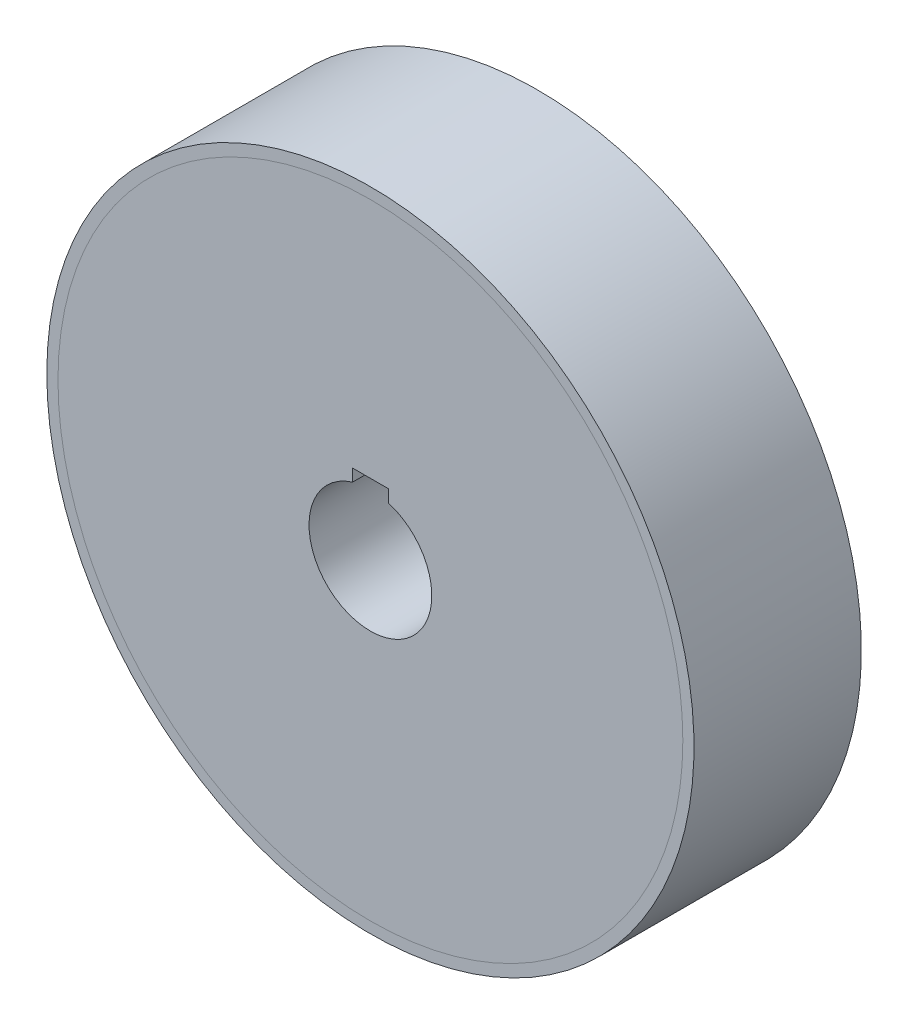
ISO-10303-21;
HEADER;
FILE_DESCRIPTION(('STEP AP214'),'2;1');
FILE_NAME('part.step','',(''),(''),'','','');
FILE_SCHEMA(('AUTOMOTIVE_DESIGN { 1 0 10303 214 1 1 1 1 }'));
ENDSEC;
DATA;
#1=APPLICATION_CONTEXT('core data for automotive mechanical design processes');
#2=APPLICATION_PROTOCOL_DEFINITION('international standard','automotive_design',2000,#1);
#3=PRODUCT_CONTEXT('',#1,'mechanical');
#4=PRODUCT('Part','Part','',(#3));
#5=PRODUCT_RELATED_PRODUCT_CATEGORY('part','',(#4));
#6=PRODUCT_DEFINITION_FORMATION('','',#4);
#7=PRODUCT_DEFINITION_CONTEXT('part definition',#1,'design');
#8=PRODUCT_DEFINITION('design','',#6,#7);
#9=PRODUCT_DEFINITION_SHAPE('','',#8);
#10=(LENGTH_UNIT() NAMED_UNIT(*) SI_UNIT(.MILLI.,.METRE.));
#11=(NAMED_UNIT(*) PLANE_ANGLE_UNIT() SI_UNIT($,.RADIAN.));
#12=(NAMED_UNIT(*) SI_UNIT($,.STERADIAN.) SOLID_ANGLE_UNIT());
#13=UNCERTAINTY_MEASURE_WITH_UNIT(LENGTH_MEASURE(1.E-05),#10,'distance_accuracy_value','');
#14=(GEOMETRIC_REPRESENTATION_CONTEXT(3) GLOBAL_UNCERTAINTY_ASSIGNED_CONTEXT((#13)) GLOBAL_UNIT_ASSIGNED_CONTEXT((#10,
#11,#12)) REPRESENTATION_CONTEXT('',''));
#15=CARTESIAN_POINT('',(0.,0.,0.));
#16=DIRECTION('',(0.,0.,1.));
#17=DIRECTION('',(1.,0.,0.));
#18=AXIS2_PLACEMENT_3D('',#15,#16,#17);
#19=CARTESIAN_POINT('',(0.,0.,485.121933088198));
#20=DIRECTION('',(0.,0.,-1.));
#21=DIRECTION('',(-1.,0.,0.));
#22=AXIS2_PLACEMENT_3D('',#19,#20,#21);
#23=CYLINDRICAL_SURFACE('',#22,145.);
#24=CARTESIAN_POINT('',(0.,0.,0.));
#25=DIRECTION('',(0.,0.,-1.));
#26=DIRECTION('',(-1.,0.,0.));
#27=AXIS2_PLACEMENT_3D('',#24,#25,#26);
#28=CIRCLE('',#27,145.);
#29=CARTESIAN_POINT('',(-145.,0.,0.));
#30=VERTEX_POINT('',#29);
#31=EDGE_CURVE('E68',#30,#30,#28,.T.);
#32=CARTESIAN_POINT('',(0.,0.,75.));
#33=DIRECTION('',(0.,0.,1.));
#34=DIRECTION('',(1.,0.,0.));
#35=AXIS2_PLACEMENT_3D('',#32,#33,#34);
#36=CIRCLE('',#35,145.);
#37=CARTESIAN_POINT('',(-145.,0.,75.));
#38=VERTEX_POINT('',#37);
#39=EDGE_CURVE('E64',#38,#38,#36,.F.);
#40=CARTESIAN_POINT('',(-145.,0.,0.));
#41=CARTESIAN_POINT('',(-145.,0.,0.781249999999993));
#42=CARTESIAN_POINT('',(-145.,0.,1.56249999999999));
#43=CARTESIAN_POINT('',(-145.,0.,3.12499999999999));
#44=CARTESIAN_POINT('',(-145.,0.,3.90625));
#45=CARTESIAN_POINT('',(-145.,0.,5.46875));
#46=CARTESIAN_POINT('',(-145.,0.,6.25));
#47=CARTESIAN_POINT('',(-145.,0.,7.8125));
#48=CARTESIAN_POINT('',(-145.,0.,8.59375000000001));
#49=CARTESIAN_POINT('',(-145.,0.,10.15625));
#50=CARTESIAN_POINT('',(-145.,0.,10.9375));
#51=CARTESIAN_POINT('',(-145.,0.,12.5));
#52=CARTESIAN_POINT('',(-145.,0.,13.28125));
#53=CARTESIAN_POINT('',(-145.,0.,14.84375));
#54=CARTESIAN_POINT('',(-145.,0.,15.625));
#55=CARTESIAN_POINT('',(-145.,0.,17.1875));
#56=CARTESIAN_POINT('',(-145.,0.,17.96875));
#57=CARTESIAN_POINT('',(-145.,0.,19.53125));
#58=CARTESIAN_POINT('',(-145.,0.,20.3125));
#59=CARTESIAN_POINT('',(-145.,0.,21.875));
#60=CARTESIAN_POINT('',(-145.,0.,22.65625));
#61=CARTESIAN_POINT('',(-145.,0.,24.21875));
#62=CARTESIAN_POINT('',(-145.,0.,25.));
#63=CARTESIAN_POINT('',(-145.,0.,26.5625));
#64=CARTESIAN_POINT('',(-145.,0.,27.34375));
#65=CARTESIAN_POINT('',(-145.,0.,28.90625));
#66=CARTESIAN_POINT('',(-145.,0.,29.6875));
#67=CARTESIAN_POINT('',(-145.,0.,31.25));
#68=CARTESIAN_POINT('',(-145.,0.,32.03125));
#69=CARTESIAN_POINT('',(-145.,0.,33.59375));
#70=CARTESIAN_POINT('',(-145.,0.,34.375));
#71=CARTESIAN_POINT('',(-145.,0.,35.9375));
#72=CARTESIAN_POINT('',(-145.,0.,36.71875));
#73=CARTESIAN_POINT('',(-145.,0.,38.28125));
#74=CARTESIAN_POINT('',(-145.,0.,39.0625));
#75=CARTESIAN_POINT('',(-145.,0.,40.625));
#76=CARTESIAN_POINT('',(-145.,0.,41.40625));
#77=CARTESIAN_POINT('',(-145.,0.,42.96875));
#78=CARTESIAN_POINT('',(-145.,0.,43.75));
#79=CARTESIAN_POINT('',(-145.,0.,45.3125));
#80=CARTESIAN_POINT('',(-145.,0.,46.09375));
#81=CARTESIAN_POINT('',(-145.,0.,47.65625));
#82=CARTESIAN_POINT('',(-145.,0.,48.4375));
#83=CARTESIAN_POINT('',(-145.,0.,50.));
#84=CARTESIAN_POINT('',(-145.,0.,50.78125));
#85=CARTESIAN_POINT('',(-145.,0.,52.34375));
#86=CARTESIAN_POINT('',(-145.,0.,53.125));
#87=CARTESIAN_POINT('',(-145.,0.,54.6875));
#88=CARTESIAN_POINT('',(-145.,0.,55.46875));
#89=CARTESIAN_POINT('',(-145.,0.,57.03125));
#90=CARTESIAN_POINT('',(-145.,0.,57.8125));
#91=CARTESIAN_POINT('',(-145.,0.,59.375));
#92=CARTESIAN_POINT('',(-145.,0.,60.15625));
#93=CARTESIAN_POINT('',(-145.,0.,61.71875));
#94=CARTESIAN_POINT('',(-145.,0.,62.5));
#95=CARTESIAN_POINT('',(-145.,0.,64.0625));
#96=CARTESIAN_POINT('',(-145.,0.,64.8437499999999));
#97=CARTESIAN_POINT('',(-145.,0.,66.4062499999999));
#98=CARTESIAN_POINT('',(-145.,0.,67.1875));
#99=CARTESIAN_POINT('',(-145.,0.,68.75));
#100=CARTESIAN_POINT('',(-145.,0.,69.5312499999999));
#101=CARTESIAN_POINT('',(-145.,0.,71.09375));
#102=CARTESIAN_POINT('',(-145.,0.,71.875));
#103=CARTESIAN_POINT('',(-145.,0.,73.4375));
#104=CARTESIAN_POINT('',(-145.,0.,74.21875));
#105=CARTESIAN_POINT('',(-145.,0.,75.));
#106=B_SPLINE_CURVE_WITH_KNOTS('',3,(#40,#41,#42,#43,#44,#45,#46,#47,#48,#49,#50,#51,#52,#53,
#54,#55,#56,#57,#58,#59,#60,#61,#62,#63,#64,#65,#66,#67,#68,#69,#70,#71,#72,#73,#74,#75,#76,#77,
#78,#79,#80,#81,#82,#83,#84,#85,#86,#87,#88,#89,#90,#91,#92,#93,#94,#95,#96,#97,#98,#99,#100,
#101,#102,#103,#104,#105),.UNSPECIFIED.,.F.,.F.,(4,2,2,2,2,2,2,2,2,2,2,2,2,2,2,2,2,2,2,2,2,2,2,
2,2,2,2,2,2,2,2,2,4),(0.,2.34374999999998,4.68750000000001,7.03124999999999,9.37500000000002,
11.71875,14.0625,16.40625,18.75,21.09375,23.4375,25.78125,28.125,30.46875,32.8125,35.15625,37.5,
39.84375,42.1875,44.53125,46.875,49.21875,51.5625,53.90625,56.25,58.5937499999999,60.9375,
63.28125,65.6249999999999,67.96875,70.3124999999999,72.65625,75.),.UNSPECIFIED.);
#107=EDGE_CURVE('BSEAM60',#30,#38,#106,.T.);
#108=ORIENTED_EDGE('',*,*,#31,.F.);
#109=ORIENTED_EDGE('',*,*,#39,.T.);
#110=ORIENTED_EDGE('',*,*,#107,.T.);
#111=ORIENTED_EDGE('',*,*,#107,.F.);
#112=EDGE_LOOP('',(#108,#110,#109,#111));
#113=FACE_BOUND('',#112,.T.);
#114=ADVANCED_FACE('F60',(#113),#23,.T.);
#115=CARTESIAN_POINT('',(0.,0.,485.121933088198));
#116=DIRECTION('',(0.,0.,-1.));
#117=DIRECTION('',(-1.,0.,0.));
#118=AXIS2_PLACEMENT_3D('',#115,#116,#117);
#119=CYLINDRICAL_SURFACE('',#118,140.);
#120=CARTESIAN_POINT('',(0.,0.,0.));
#121=DIRECTION('',(0.,0.,-1.));
#122=DIRECTION('',(-1.,0.,0.));
#123=AXIS2_PLACEMENT_3D('',#120,#121,#122);
#124=CIRCLE('',#123,140.);
#125=CARTESIAN_POINT('',(-140.,0.,0.));
#126=VERTEX_POINT('',#125);
#127=EDGE_CURVE('E72',#126,#126,#124,.T.);
#128=CARTESIAN_POINT('',(0.,0.,75.));
#129=DIRECTION('',(0.,0.,1.));
#130=DIRECTION('',(1.,0.,0.));
#131=AXIS2_PLACEMENT_3D('',#128,#129,#130);
#132=CIRCLE('',#131,140.);
#133=CARTESIAN_POINT('',(-140.,0.,75.));
#134=VERTEX_POINT('',#133);
#135=EDGE_CURVE('E13',#134,#134,#132,.F.);
#136=CARTESIAN_POINT('',(-140.,0.,0.));
#137=CARTESIAN_POINT('',(-140.,0.,0.781249999999993));
#138=CARTESIAN_POINT('',(-140.,0.,1.56249999999999));
#139=CARTESIAN_POINT('',(-140.,0.,3.12499999999999));
#140=CARTESIAN_POINT('',(-140.,0.,3.90625));
#141=CARTESIAN_POINT('',(-140.,0.,5.46875));
#142=CARTESIAN_POINT('',(-140.,0.,6.25));
#143=CARTESIAN_POINT('',(-140.,0.,7.8125));
#144=CARTESIAN_POINT('',(-140.,0.,8.59375000000001));
#145=CARTESIAN_POINT('',(-140.,0.,10.15625));
#146=CARTESIAN_POINT('',(-140.,0.,10.9375));
#147=CARTESIAN_POINT('',(-140.,0.,12.5));
#148=CARTESIAN_POINT('',(-140.,0.,13.28125));
#149=CARTESIAN_POINT('',(-140.,0.,14.84375));
#150=CARTESIAN_POINT('',(-140.,0.,15.625));
#151=CARTESIAN_POINT('',(-140.,0.,17.1875));
#152=CARTESIAN_POINT('',(-140.,0.,17.96875));
#153=CARTESIAN_POINT('',(-140.,0.,19.53125));
#154=CARTESIAN_POINT('',(-140.,0.,20.3125));
#155=CARTESIAN_POINT('',(-140.,0.,21.875));
#156=CARTESIAN_POINT('',(-140.,0.,22.65625));
#157=CARTESIAN_POINT('',(-140.,0.,24.21875));
#158=CARTESIAN_POINT('',(-140.,0.,25.));
#159=CARTESIAN_POINT('',(-140.,0.,26.5625));
#160=CARTESIAN_POINT('',(-140.,0.,27.34375));
#161=CARTESIAN_POINT('',(-140.,0.,28.90625));
#162=CARTESIAN_POINT('',(-140.,0.,29.6875));
#163=CARTESIAN_POINT('',(-140.,0.,31.25));
#164=CARTESIAN_POINT('',(-140.,0.,32.03125));
#165=CARTESIAN_POINT('',(-140.,0.,33.59375));
#166=CARTESIAN_POINT('',(-140.,0.,34.375));
#167=CARTESIAN_POINT('',(-140.,0.,35.9375));
#168=CARTESIAN_POINT('',(-140.,0.,36.71875));
#169=CARTESIAN_POINT('',(-140.,0.,38.28125));
#170=CARTESIAN_POINT('',(-140.,0.,39.0625));
#171=CARTESIAN_POINT('',(-140.,0.,40.625));
#172=CARTESIAN_POINT('',(-140.,0.,41.40625));
#173=CARTESIAN_POINT('',(-140.,0.,42.96875));
#174=CARTESIAN_POINT('',(-140.,0.,43.75));
#175=CARTESIAN_POINT('',(-140.,0.,45.3125));
#176=CARTESIAN_POINT('',(-140.,0.,46.09375));
#177=CARTESIAN_POINT('',(-140.,0.,47.65625));
#178=CARTESIAN_POINT('',(-140.,0.,48.4375));
#179=CARTESIAN_POINT('',(-140.,0.,50.));
#180=CARTESIAN_POINT('',(-140.,0.,50.78125));
#181=CARTESIAN_POINT('',(-140.,0.,52.34375));
#182=CARTESIAN_POINT('',(-140.,0.,53.125));
#183=CARTESIAN_POINT('',(-140.,0.,54.6875));
#184=CARTESIAN_POINT('',(-140.,0.,55.46875));
#185=CARTESIAN_POINT('',(-140.,0.,57.03125));
#186=CARTESIAN_POINT('',(-140.,0.,57.8125));
#187=CARTESIAN_POINT('',(-140.,0.,59.375));
#188=CARTESIAN_POINT('',(-140.,0.,60.15625));
#189=CARTESIAN_POINT('',(-140.,0.,61.71875));
#190=CARTESIAN_POINT('',(-140.,0.,62.5));
#191=CARTESIAN_POINT('',(-140.,0.,64.0625));
#192=CARTESIAN_POINT('',(-140.,0.,64.8437499999999));
#193=CARTESIAN_POINT('',(-140.,0.,66.4062499999999));
#194=CARTESIAN_POINT('',(-140.,0.,67.1875));
#195=CARTESIAN_POINT('',(-140.,0.,68.75));
#196=CARTESIAN_POINT('',(-140.,0.,69.5312499999999));
#197=CARTESIAN_POINT('',(-140.,0.,71.09375));
#198=CARTESIAN_POINT('',(-140.,0.,71.875));
#199=CARTESIAN_POINT('',(-140.,0.,73.4375));
#200=CARTESIAN_POINT('',(-140.,0.,74.21875));
#201=CARTESIAN_POINT('',(-140.,0.,75.));
#202=B_SPLINE_CURVE_WITH_KNOTS('',3,(#136,#137,#138,#139,#140,#141,#142,#143,#144,#145,#146,
#147,#148,#149,#150,#151,#152,#153,#154,#155,#156,#157,#158,#159,#160,#161,#162,#163,#164,#165,
#166,#167,#168,#169,#170,#171,#172,#173,#174,#175,#176,#177,#178,#179,#180,#181,#182,#183,#184,
#185,#186,#187,#188,#189,#190,#191,#192,#193,#194,#195,#196,#197,#198,#199,#200,#201),
.UNSPECIFIED.,.F.,.F.,(4,2,2,2,2,2,2,2,2,2,2,2,2,2,2,2,2,2,2,2,2,2,2,2,2,2,2,2,2,2,2,2,4),(0.,
2.34374999999998,4.68750000000001,7.03124999999999,9.37500000000002,11.71875,14.0625,16.40625,
18.75,21.09375,23.4375,25.78125,28.125,30.46875,32.8125,35.15625,37.5,39.84375,42.1875,44.53125,
46.875,49.21875,51.5625,53.90625,56.25,58.5937499999999,60.9375,63.28125,65.6249999999999,
67.96875,70.3124999999999,72.65625,75.),.UNSPECIFIED.);
#203=EDGE_CURVE('BSEAM87',#126,#134,#202,.T.);
#204=ORIENTED_EDGE('',*,*,#127,.T.);
#205=ORIENTED_EDGE('',*,*,#135,.F.);
#206=ORIENTED_EDGE('',*,*,#203,.T.);
#207=ORIENTED_EDGE('',*,*,#203,.F.);
#208=EDGE_LOOP('',(#204,#206,#205,#207));
#209=FACE_BOUND('',#208,.T.);
#210=ADVANCED_FACE('F87',(#209),#119,.F.);
#211=CARTESIAN_POINT('',(0.,0.,0.));
#212=DIRECTION('',(0.,0.,-1.));
#213=DIRECTION('',(-1.,0.,0.));
#214=AXIS2_PLACEMENT_3D('',#211,#212,#213);
#215=PLANE('',#214);
#216=ORIENTED_EDGE('',*,*,#127,.F.);
#217=EDGE_LOOP('',(#216));
#218=FACE_BOUND('',#217,.T.);
#219=ORIENTED_EDGE('',*,*,#31,.T.);
#220=EDGE_LOOP('',(#219));
#221=FACE_BOUND('',#220,.T.);
#222=ADVANCED_FACE('F83',(#218,#221),#215,.T.);
#223=CARTESIAN_POINT('',(0.,0.,75.));
#224=DIRECTION('',(0.,0.,1.));
#225=DIRECTION('',(1.,0.,0.));
#226=AXIS2_PLACEMENT_3D('',#223,#224,#225);
#227=PLANE('',#226);
#228=ORIENTED_EDGE('',*,*,#39,.F.);
#229=EDGE_LOOP('',(#228));
#230=FACE_BOUND('',#229,.T.);
#231=ORIENTED_EDGE('',*,*,#135,.T.);
#232=EDGE_LOOP('',(#231));
#233=FACE_BOUND('',#232,.T.);
#234=ADVANCED_FACE('F62',(#230,#233),#227,.T.);
#235=CLOSED_SHELL('',(#114,#210,#222,#234));
#236=MANIFOLD_SOLID_BREP('B2',#235);
#237=CARTESIAN_POINT('',(0.,0.,75.));
#238=DIRECTION('',(0.,0.,-1.));
#239=DIRECTION('',(-1.,0.,0.));
#240=AXIS2_PLACEMENT_3D('',#237,#238,#239);
#241=CYLINDRICAL_SURFACE('',#240,140.);
#242=CARTESIAN_POINT('',(0.,0.,75.));
#243=DIRECTION('',(0.,0.,1.));
#244=DIRECTION('',(1.,0.,0.));
#245=AXIS2_PLACEMENT_3D('',#242,#243,#244);
#246=CIRCLE('',#245,140.);
#247=CARTESIAN_POINT('',(140.,0.,75.));
#248=VERTEX_POINT('',#247);
#249=EDGE_CURVE('E58',#248,#248,#246,.T.);
#250=ORIENTED_EDGE('',*,*,#249,.F.);
#251=EDGE_LOOP('',(#250));
#252=FACE_BOUND('',#251,.T.);
#253=CARTESIAN_POINT('',(0.,0.,0.));
#254=DIRECTION('',(0.,0.,1.));
#255=DIRECTION('',(1.,0.,0.));
#256=AXIS2_PLACEMENT_3D('',#253,#254,#255);
#257=CIRCLE('',#256,140.);
#258=CARTESIAN_POINT('',(140.,0.,0.));
#259=VERTEX_POINT('',#258);
#260=EDGE_CURVE('E122',#259,#259,#257,.T.);
#261=ORIENTED_EDGE('',*,*,#260,.T.);
#262=EDGE_LOOP('',(#261));
#263=FACE_BOUND('',#262,.T.);
#264=ADVANCED_FACE('F119',(#252,#263),#241,.T.);
#265=CARTESIAN_POINT('',(0.,0.,75.));
#266=DIRECTION('',(0.,0.,1.));
#267=DIRECTION('',(1.,0.,0.));
#268=AXIS2_PLACEMENT_3D('',#265,#266,#267);
#269=PLANE('',#268);
#270=DIRECTION('',(0.,-1.,0.));
#271=VECTOR('',#270,1.);
#272=CARTESIAN_POINT('',(8.00000000000001,26.3106442338457,75.));
#273=LINE('',#272,#271);
#274=CARTESIAN_POINT('',(8.00000000000001,31.8,75.));
#275=VERTEX_POINT('',#274);
#276=CARTESIAN_POINT('',(8.00000000000001,26.3106442338457,75.));
#277=VERTEX_POINT('',#276);
#278=EDGE_CURVE('E175',#275,#277,#273,.T.);
#279=ORIENTED_EDGE('',*,*,#278,.T.);
#280=CARTESIAN_POINT('',(0.,0.,75.));
#281=DIRECTION('',(0.,0.,-1.));
#282=DIRECTION('',(-1.,0.,0.));
#283=AXIS2_PLACEMENT_3D('',#280,#281,#282);
#284=CIRCLE('',#283,27.5);
#285=CARTESIAN_POINT('',(-8.00000000000001,26.3106442338457,75.));
#286=VERTEX_POINT('',#285);
#287=EDGE_CURVE('E181',#277,#286,#284,.T.);
#288=ORIENTED_EDGE('',*,*,#287,.T.);
#289=DIRECTION('',(0.,1.,0.));
#290=VECTOR('',#289,1.);
#291=CARTESIAN_POINT('',(-8.00000000000001,26.3106442338457,75.));
#292=LINE('',#291,#290);
#293=CARTESIAN_POINT('',(-8.00000000000001,31.8,75.));
#294=VERTEX_POINT('',#293);
#295=EDGE_CURVE('E133',#286,#294,#292,.T.);
#296=ORIENTED_EDGE('',*,*,#295,.T.);
#297=DIRECTION('',(1.,0.,0.));
#298=VECTOR('',#297,1.);
#299=CARTESIAN_POINT('',(8.00000000000001,31.8,75.));
#300=LINE('',#299,#298);
#301=EDGE_CURVE('E172',#294,#275,#300,.T.);
#302=ORIENTED_EDGE('',*,*,#301,.T.);
#303=EDGE_LOOP('',(#279,#288,#296,#302));
#304=FACE_BOUND('',#303,.T.);
#305=ORIENTED_EDGE('',*,*,#249,.T.);
#306=EDGE_LOOP('',(#305));
#307=FACE_BOUND('',#306,.T.);
#308=ADVANCED_FACE('F178',(#304,#307),#269,.T.);
#309=CARTESIAN_POINT('',(0.,0.,0.));
#310=DIRECTION('',(0.,0.,1.));
#311=DIRECTION('',(1.,0.,0.));
#312=AXIS2_PLACEMENT_3D('',#309,#310,#311);
#313=PLANE('',#312);
#314=CARTESIAN_POINT('',(0.,0.,0.));
#315=DIRECTION('',(0.,0.,-1.));
#316=DIRECTION('',(-1.,0.,0.));
#317=AXIS2_PLACEMENT_3D('',#314,#315,#316);
#318=CIRCLE('',#317,27.5);
#319=CARTESIAN_POINT('',(8.00000000000001,26.3106442338457,0.));
#320=VERTEX_POINT('',#319);
#321=CARTESIAN_POINT('',(-8.00000000000001,26.3106442338457,0.));
#322=VERTEX_POINT('',#321);
#323=EDGE_CURVE('E190',#320,#322,#318,.T.);
#324=ORIENTED_EDGE('',*,*,#323,.F.);
#325=DIRECTION('',(0.,-1.,0.));
#326=VECTOR('',#325,1.);
#327=CARTESIAN_POINT('',(8.00000000000001,26.3106442338457,0.));
#328=LINE('',#327,#326);
#329=CARTESIAN_POINT('',(8.00000000000001,31.8,0.));
#330=VERTEX_POINT('',#329);
#331=EDGE_CURVE('E158',#330,#320,#328,.T.);
#332=ORIENTED_EDGE('',*,*,#331,.F.);
#333=DIRECTION('',(1.,0.,0.));
#334=VECTOR('',#333,1.);
#335=CARTESIAN_POINT('',(8.00000000000001,31.8,0.));
#336=LINE('',#335,#334);
#337=CARTESIAN_POINT('',(-8.00000000000001,31.8,0.));
#338=VERTEX_POINT('',#337);
#339=EDGE_CURVE('E183',#338,#330,#336,.T.);
#340=ORIENTED_EDGE('',*,*,#339,.F.);
#341=DIRECTION('',(0.,1.,0.));
#342=VECTOR('',#341,1.);
#343=CARTESIAN_POINT('',(-8.00000000000001,26.3106442338457,0.));
#344=LINE('',#343,#342);
#345=EDGE_CURVE('E164',#322,#338,#344,.T.);
#346=ORIENTED_EDGE('',*,*,#345,.F.);
#347=EDGE_LOOP('',(#324,#332,#340,#346));
#348=FACE_BOUND('',#347,.T.);
#349=ORIENTED_EDGE('',*,*,#260,.F.);
#350=EDGE_LOOP('',(#349));
#351=FACE_BOUND('',#350,.T.);
#352=ADVANCED_FACE('F199',(#348,#351),#313,.F.);
#353=CARTESIAN_POINT('',(0.,0.,75.));
#354=DIRECTION('',(0.,0.,-1.));
#355=DIRECTION('',(-1.,0.,0.));
#356=AXIS2_PLACEMENT_3D('',#353,#354,#355);
#357=CYLINDRICAL_SURFACE('',#356,27.5);
#358=ORIENTED_EDGE('',*,*,#287,.F.);
#359=DIRECTION('',(0.,0.,-1.));
#360=VECTOR('',#359,1.);
#361=CARTESIAN_POINT('',(8.00000000000001,26.3106442338457,75.));
#362=LINE('',#361,#360);
#363=EDGE_CURVE('E142',#277,#320,#362,.T.);
#364=ORIENTED_EDGE('',*,*,#363,.T.);
#365=ORIENTED_EDGE('',*,*,#323,.T.);
#366=DIRECTION('',(0.,0.,-1.));
#367=VECTOR('',#366,1.);
#368=CARTESIAN_POINT('',(-8.00000000000001,26.3106442338457,75.));
#369=LINE('',#368,#367);
#370=EDGE_CURVE('E169',#286,#322,#369,.T.);
#371=ORIENTED_EDGE('',*,*,#370,.F.);
#372=EDGE_LOOP('',(#358,#364,#365,#371));
#373=FACE_BOUND('',#372,.T.);
#374=ADVANCED_FACE('F197',(#373),#357,.F.);
#375=CARTESIAN_POINT('',(8.00000000000001,26.3106442338457,75.));
#376=DIRECTION('',(1.,0.,0.));
#377=DIRECTION('',(0.,0.,-1.));
#378=AXIS2_PLACEMENT_3D('',#375,#376,#377);
#379=PLANE('',#378);
#380=ORIENTED_EDGE('',*,*,#331,.T.);
#381=ORIENTED_EDGE('',*,*,#363,.F.);
#382=ORIENTED_EDGE('',*,*,#278,.F.);
#383=DIRECTION('',(0.,0.,-1.));
#384=VECTOR('',#383,1.);
#385=CARTESIAN_POINT('',(8.00000000000001,31.8,75.));
#386=LINE('',#385,#384);
#387=EDGE_CURVE('E168',#275,#330,#386,.T.);
#388=ORIENTED_EDGE('',*,*,#387,.T.);
#389=EDGE_LOOP('',(#380,#381,#382,#388));
#390=FACE_BOUND('',#389,.T.);
#391=ADVANCED_FACE('F217',(#390),#379,.F.);
#392=CARTESIAN_POINT('',(8.00000000000001,31.8,75.));
#393=DIRECTION('',(0.,1.,0.));
#394=DIRECTION('',(0.,0.,1.));
#395=AXIS2_PLACEMENT_3D('',#392,#393,#394);
#396=PLANE('',#395);
#397=ORIENTED_EDGE('',*,*,#339,.T.);
#398=ORIENTED_EDGE('',*,*,#387,.F.);
#399=ORIENTED_EDGE('',*,*,#301,.F.);
#400=DIRECTION('',(0.,0.,-1.));
#401=VECTOR('',#400,1.);
#402=CARTESIAN_POINT('',(-8.00000000000001,31.8,75.));
#403=LINE('',#402,#401);
#404=EDGE_CURVE('E160',#294,#338,#403,.T.);
#405=ORIENTED_EDGE('',*,*,#404,.T.);
#406=EDGE_LOOP('',(#397,#398,#399,#405));
#407=FACE_BOUND('',#406,.T.);
#408=ADVANCED_FACE('F173',(#407),#396,.F.);
#409=CARTESIAN_POINT('',(-8.00000000000001,26.3106442338457,75.));
#410=DIRECTION('',(-1.,0.,0.));
#411=DIRECTION('',(0.,0.,1.));
#412=AXIS2_PLACEMENT_3D('',#409,#410,#411);
#413=PLANE('',#412);
#414=ORIENTED_EDGE('',*,*,#345,.T.);
#415=ORIENTED_EDGE('',*,*,#404,.F.);
#416=ORIENTED_EDGE('',*,*,#295,.F.);
#417=ORIENTED_EDGE('',*,*,#370,.T.);
#418=EDGE_LOOP('',(#414,#415,#416,#417));
#419=FACE_BOUND('',#418,.T.);
#420=ADVANCED_FACE('F162',(#419),#413,.F.);
#421=CLOSED_SHELL('',(#264,#308,#352,#374,#391,#408,#420));
#422=MANIFOLD_SOLID_BREP('B8',#421);
#423=ADVANCED_BREP_SHAPE_REPRESENTATION('',(#18,#236,#422),#14);
#424=SHAPE_DEFINITION_REPRESENTATION(#9,#423);
ENDSEC;
END-ISO-10303-21;
